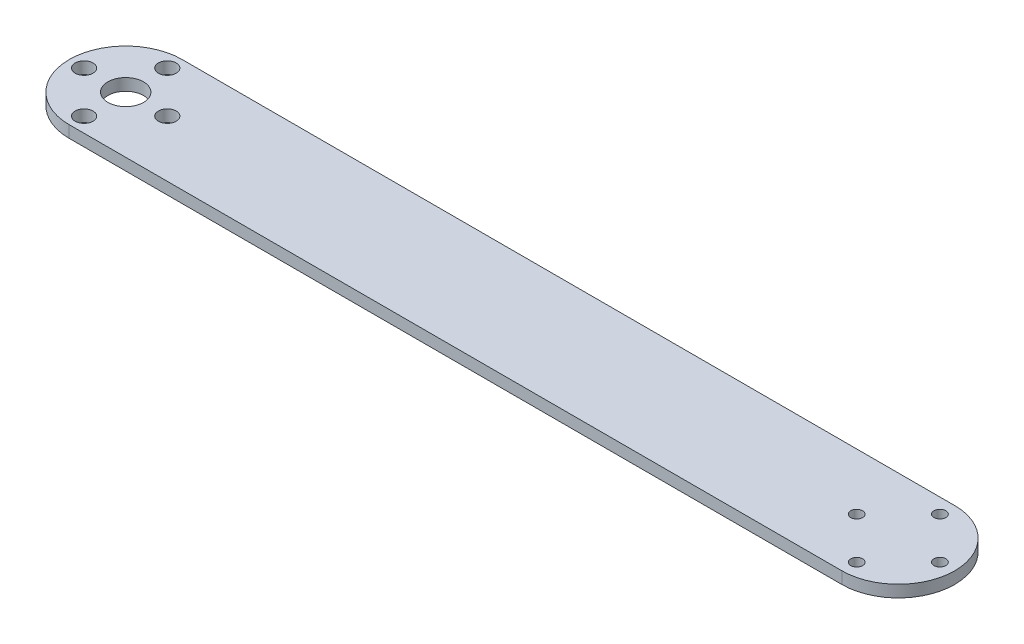
ISO-10303-21;
HEADER;
FILE_DESCRIPTION(('STEP AP214'),'2;1');
FILE_NAME('part.step','',(''),(''),'','','');
FILE_SCHEMA(('AUTOMOTIVE_DESIGN { 1 0 10303 214 1 1 1 1 }'));
ENDSEC;
DATA;
#1=APPLICATION_CONTEXT('core data for automotive mechanical design processes');
#2=APPLICATION_PROTOCOL_DEFINITION('international standard','automotive_design',2000,#1);
#3=PRODUCT_CONTEXT('',#1,'mechanical');
#4=PRODUCT('Part','Part','',(#3));
#5=PRODUCT_RELATED_PRODUCT_CATEGORY('part','',(#4));
#6=PRODUCT_DEFINITION_FORMATION('','',#4);
#7=PRODUCT_DEFINITION_CONTEXT('part definition',#1,'design');
#8=PRODUCT_DEFINITION('design','',#6,#7);
#9=PRODUCT_DEFINITION_SHAPE('','',#8);
#10=(LENGTH_UNIT() NAMED_UNIT(*) SI_UNIT(.MILLI.,.METRE.));
#11=(NAMED_UNIT(*) PLANE_ANGLE_UNIT() SI_UNIT($,.RADIAN.));
#12=(NAMED_UNIT(*) SI_UNIT($,.STERADIAN.) SOLID_ANGLE_UNIT());
#13=UNCERTAINTY_MEASURE_WITH_UNIT(LENGTH_MEASURE(1.E-05),#10,'distance_accuracy_value','');
#14=(GEOMETRIC_REPRESENTATION_CONTEXT(3) GLOBAL_UNCERTAINTY_ASSIGNED_CONTEXT((#13)) GLOBAL_UNIT_ASSIGNED_CONTEXT((#10,
#11,#12)) REPRESENTATION_CONTEXT('',''));
#15=CARTESIAN_POINT('',(0.,0.,0.));
#16=DIRECTION('',(0.,0.,1.));
#17=DIRECTION('',(1.,0.,0.));
#18=AXIS2_PLACEMENT_3D('',#15,#16,#17);
#19=CARTESIAN_POINT('',(0.,2.,0.));
#20=DIRECTION('',(0.,1.,0.));
#21=DIRECTION('',(0.,0.,1.));
#22=AXIS2_PLACEMENT_3D('',#19,#20,#21);
#23=PLANE('',#22);
#24=CARTESIAN_POINT('',(123.,2.,0.));
#25=DIRECTION('',(0.,1.,0.));
#26=DIRECTION('',(0.,0.,1.));
#27=AXIS2_PLACEMENT_3D('',#24,#25,#26);
#28=CIRCLE('',#27,0.999999999999998);
#29=CARTESIAN_POINT('',(123.,2.,0.999999999999998));
#30=VERTEX_POINT('',#29);
#31=EDGE_CURVE('E152',#30,#30,#28,.T.);
#32=ORIENTED_EDGE('',*,*,#31,.F.);
#33=EDGE_LOOP('',(#32));
#34=FACE_BOUND('',#33,.T.);
#35=CARTESIAN_POINT('',(130.,2.,-7.00000000000001));
#36=DIRECTION('',(0.,1.,0.));
#37=DIRECTION('',(0.,0.,1.));
#38=AXIS2_PLACEMENT_3D('',#35,#36,#37);
#39=CIRCLE('',#38,0.999999999999998);
#40=CARTESIAN_POINT('',(130.,2.,-6.00000000000002));
#41=VERTEX_POINT('',#40);
#42=EDGE_CURVE('E140',#41,#41,#39,.T.);
#43=ORIENTED_EDGE('',*,*,#42,.F.);
#44=EDGE_LOOP('',(#43));
#45=FACE_BOUND('',#44,.T.);
#46=CARTESIAN_POINT('',(-7.,2.,0.));
#47=DIRECTION('',(0.,1.,0.));
#48=DIRECTION('',(0.,0.,1.));
#49=AXIS2_PLACEMENT_3D('',#46,#47,#48);
#50=CIRCLE('',#49,1.5);
#51=CARTESIAN_POINT('',(-7.,2.,1.5));
#52=VERTEX_POINT('',#51);
#53=EDGE_CURVE('E128',#52,#52,#50,.T.);
#54=ORIENTED_EDGE('',*,*,#53,.F.);
#55=EDGE_LOOP('',(#54));
#56=FACE_BOUND('',#55,.T.);
#57=CARTESIAN_POINT('',(7.,2.,0.));
#58=DIRECTION('',(0.,1.,0.));
#59=DIRECTION('',(0.,0.,1.));
#60=AXIS2_PLACEMENT_3D('',#57,#58,#59);
#61=CIRCLE('',#60,1.5);
#62=CARTESIAN_POINT('',(7.,2.,1.5));
#63=VERTEX_POINT('',#62);
#64=EDGE_CURVE('E116',#63,#63,#61,.T.);
#65=ORIENTED_EDGE('',*,*,#64,.F.);
#66=EDGE_LOOP('',(#65));
#67=FACE_BOUND('',#66,.T.);
#68=CARTESIAN_POINT('',(0.,2.,0.));
#69=DIRECTION('',(0.,1.,0.));
#70=DIRECTION('',(0.,0.,1.));
#71=AXIS2_PLACEMENT_3D('',#68,#69,#70);
#72=CIRCLE('',#71,9.5);
#73=CARTESIAN_POINT('',(0.,2.,-9.5));
#74=VERTEX_POINT('',#73);
#75=CARTESIAN_POINT('',(0.,2.,9.5));
#76=VERTEX_POINT('',#75);
#77=EDGE_CURVE('E86',#74,#76,#72,.T.);
#78=ORIENTED_EDGE('',*,*,#77,.T.);
#79=DIRECTION('',(1.,0.,0.));
#80=VECTOR('',#79,1.);
#81=CARTESIAN_POINT('',(0.,2.,9.5));
#82=LINE('',#81,#80);
#83=CARTESIAN_POINT('',(130.,2.,9.5));
#84=VERTEX_POINT('',#83);
#85=EDGE_CURVE('E81',#76,#84,#82,.T.);
#86=ORIENTED_EDGE('',*,*,#85,.T.);
#87=CARTESIAN_POINT('',(130.,2.,0.));
#88=DIRECTION('',(0.,1.,0.));
#89=DIRECTION('',(0.,0.,1.));
#90=AXIS2_PLACEMENT_3D('',#87,#88,#89);
#91=CIRCLE('',#90,9.5);
#92=CARTESIAN_POINT('',(130.,2.,-9.5));
#93=VERTEX_POINT('',#92);
#94=EDGE_CURVE('E84',#84,#93,#91,.T.);
#95=ORIENTED_EDGE('',*,*,#94,.T.);
#96=DIRECTION('',(-1.,0.,0.));
#97=VECTOR('',#96,1.);
#98=CARTESIAN_POINT('',(0.,2.,-9.5));
#99=LINE('',#98,#97);
#100=EDGE_CURVE('E51',#93,#74,#99,.T.);
#101=ORIENTED_EDGE('',*,*,#100,.T.);
#102=EDGE_LOOP('',(#78,#86,#95,#101));
#103=FACE_BOUND('',#102,.T.);
#104=CARTESIAN_POINT('',(0.,2.,-7.));
#105=DIRECTION('',(0.,1.,0.));
#106=DIRECTION('',(0.,0.,1.));
#107=AXIS2_PLACEMENT_3D('',#104,#105,#106);
#108=CIRCLE('',#107,1.5);
#109=CARTESIAN_POINT('',(0.,2.,-5.5));
#110=VERTEX_POINT('',#109);
#111=EDGE_CURVE('E101',#110,#110,#108,.T.);
#112=ORIENTED_EDGE('',*,*,#111,.F.);
#113=EDGE_LOOP('',(#112));
#114=FACE_BOUND('',#113,.T.);
#115=CARTESIAN_POINT('',(0.,2.,7.));
#116=DIRECTION('',(0.,1.,0.));
#117=DIRECTION('',(0.,0.,1.));
#118=AXIS2_PLACEMENT_3D('',#115,#116,#117);
#119=CIRCLE('',#118,1.5);
#120=CARTESIAN_POINT('',(0.,2.,8.5));
#121=VERTEX_POINT('',#120);
#122=EDGE_CURVE('E122',#121,#121,#119,.T.);
#123=ORIENTED_EDGE('',*,*,#122,.F.);
#124=EDGE_LOOP('',(#123));
#125=FACE_BOUND('',#124,.T.);
#126=CARTESIAN_POINT('',(0.,2.,0.));
#127=DIRECTION('',(0.,1.,0.));
#128=DIRECTION('',(0.,0.,1.));
#129=AXIS2_PLACEMENT_3D('',#126,#127,#128);
#130=CIRCLE('',#129,3.);
#131=CARTESIAN_POINT('',(0.,2.,3.));
#132=VERTEX_POINT('',#131);
#133=EDGE_CURVE('E134',#132,#132,#130,.T.);
#134=ORIENTED_EDGE('',*,*,#133,.F.);
#135=EDGE_LOOP('',(#134));
#136=FACE_BOUND('',#135,.T.);
#137=CARTESIAN_POINT('',(137.,2.,0.));
#138=DIRECTION('',(0.,1.,0.));
#139=DIRECTION('',(0.,0.,1.));
#140=AXIS2_PLACEMENT_3D('',#137,#138,#139);
#141=CIRCLE('',#140,0.999999999999998);
#142=CARTESIAN_POINT('',(137.,2.,0.999999999999998));
#143=VERTEX_POINT('',#142);
#144=EDGE_CURVE('E146',#143,#143,#141,.T.);
#145=ORIENTED_EDGE('',*,*,#144,.F.);
#146=EDGE_LOOP('',(#145));
#147=FACE_BOUND('',#146,.T.);
#148=CARTESIAN_POINT('',(130.,2.,7.00000000000001));
#149=DIRECTION('',(0.,1.,0.));
#150=DIRECTION('',(0.,0.,1.));
#151=AXIS2_PLACEMENT_3D('',#148,#149,#150);
#152=CIRCLE('',#151,0.999999999999998);
#153=CARTESIAN_POINT('',(130.,2.,8.00000000000001));
#154=VERTEX_POINT('',#153);
#155=EDGE_CURVE('E158',#154,#154,#152,.T.);
#156=ORIENTED_EDGE('',*,*,#155,.F.);
#157=EDGE_LOOP('',(#156));
#158=FACE_BOUND('',#157,.T.);
#159=ADVANCED_FACE('F34',(#34,#45,#56,#67,#103,#114,#125,#136,#147,#158),#23,.T.);
#160=CARTESIAN_POINT('',(0.,0.,0.));
#161=DIRECTION('',(0.,1.,0.));
#162=DIRECTION('',(0.,0.,1.));
#163=AXIS2_PLACEMENT_3D('',#160,#161,#162);
#164=PLANE('',#163);
#165=CARTESIAN_POINT('',(0.,0.,0.));
#166=DIRECTION('',(0.,1.,0.));
#167=DIRECTION('',(0.,0.,1.));
#168=AXIS2_PLACEMENT_3D('',#165,#166,#167);
#169=CIRCLE('',#168,9.5);
#170=CARTESIAN_POINT('',(0.,0.,-9.5));
#171=VERTEX_POINT('',#170);
#172=CARTESIAN_POINT('',(0.,0.,9.5));
#173=VERTEX_POINT('',#172);
#174=EDGE_CURVE('E98',#171,#173,#169,.T.);
#175=ORIENTED_EDGE('',*,*,#174,.F.);
#176=DIRECTION('',(-1.,0.,0.));
#177=VECTOR('',#176,1.);
#178=CARTESIAN_POINT('',(0.,0.,-9.5));
#179=LINE('',#178,#177);
#180=CARTESIAN_POINT('',(130.,0.,-9.5));
#181=VERTEX_POINT('',#180);
#182=EDGE_CURVE('E74',#181,#171,#179,.T.);
#183=ORIENTED_EDGE('',*,*,#182,.F.);
#184=CARTESIAN_POINT('',(130.,0.,0.));
#185=DIRECTION('',(0.,1.,0.));
#186=DIRECTION('',(0.,0.,1.));
#187=AXIS2_PLACEMENT_3D('',#184,#185,#186);
#188=CIRCLE('',#187,9.5);
#189=CARTESIAN_POINT('',(130.,0.,9.5));
#190=VERTEX_POINT('',#189);
#191=EDGE_CURVE('E68',#190,#181,#188,.T.);
#192=ORIENTED_EDGE('',*,*,#191,.F.);
#193=DIRECTION('',(1.,0.,0.));
#194=VECTOR('',#193,1.);
#195=CARTESIAN_POINT('',(0.,0.,9.5));
#196=LINE('',#195,#194);
#197=EDGE_CURVE('E90',#173,#190,#196,.T.);
#198=ORIENTED_EDGE('',*,*,#197,.F.);
#199=EDGE_LOOP('',(#175,#183,#192,#198));
#200=FACE_BOUND('',#199,.T.);
#201=CARTESIAN_POINT('',(0.,0.,-7.));
#202=DIRECTION('',(0.,1.,0.));
#203=DIRECTION('',(0.,0.,1.));
#204=AXIS2_PLACEMENT_3D('',#201,#202,#203);
#205=CIRCLE('',#204,1.5);
#206=CARTESIAN_POINT('',(0.,0.,-5.5));
#207=VERTEX_POINT('',#206);
#208=EDGE_CURVE('E113',#207,#207,#205,.T.);
#209=ORIENTED_EDGE('',*,*,#208,.T.);
#210=EDGE_LOOP('',(#209));
#211=FACE_BOUND('',#210,.T.);
#212=CARTESIAN_POINT('',(7.,0.,0.));
#213=DIRECTION('',(0.,1.,0.));
#214=DIRECTION('',(0.,0.,1.));
#215=AXIS2_PLACEMENT_3D('',#212,#213,#214);
#216=CIRCLE('',#215,1.5);
#217=CARTESIAN_POINT('',(7.,0.,1.5));
#218=VERTEX_POINT('',#217);
#219=EDGE_CURVE('E119',#218,#218,#216,.T.);
#220=ORIENTED_EDGE('',*,*,#219,.T.);
#221=EDGE_LOOP('',(#220));
#222=FACE_BOUND('',#221,.T.);
#223=CARTESIAN_POINT('',(0.,0.,7.));
#224=DIRECTION('',(0.,1.,0.));
#225=DIRECTION('',(0.,0.,1.));
#226=AXIS2_PLACEMENT_3D('',#223,#224,#225);
#227=CIRCLE('',#226,1.5);
#228=CARTESIAN_POINT('',(0.,0.,8.5));
#229=VERTEX_POINT('',#228);
#230=EDGE_CURVE('E125',#229,#229,#227,.T.);
#231=ORIENTED_EDGE('',*,*,#230,.T.);
#232=EDGE_LOOP('',(#231));
#233=FACE_BOUND('',#232,.T.);
#234=CARTESIAN_POINT('',(-7.,0.,0.));
#235=DIRECTION('',(0.,1.,0.));
#236=DIRECTION('',(0.,0.,1.));
#237=AXIS2_PLACEMENT_3D('',#234,#235,#236);
#238=CIRCLE('',#237,1.5);
#239=CARTESIAN_POINT('',(-7.,0.,1.5));
#240=VERTEX_POINT('',#239);
#241=EDGE_CURVE('E131',#240,#240,#238,.T.);
#242=ORIENTED_EDGE('',*,*,#241,.T.);
#243=EDGE_LOOP('',(#242));
#244=FACE_BOUND('',#243,.T.);
#245=CARTESIAN_POINT('',(0.,0.,0.));
#246=DIRECTION('',(0.,1.,0.));
#247=DIRECTION('',(0.,0.,1.));
#248=AXIS2_PLACEMENT_3D('',#245,#246,#247);
#249=CIRCLE('',#248,3.);
#250=CARTESIAN_POINT('',(0.,0.,3.));
#251=VERTEX_POINT('',#250);
#252=EDGE_CURVE('E137',#251,#251,#249,.T.);
#253=ORIENTED_EDGE('',*,*,#252,.T.);
#254=EDGE_LOOP('',(#253));
#255=FACE_BOUND('',#254,.T.);
#256=CARTESIAN_POINT('',(130.,0.,-7.00000000000001));
#257=DIRECTION('',(0.,1.,0.));
#258=DIRECTION('',(0.,0.,1.));
#259=AXIS2_PLACEMENT_3D('',#256,#257,#258);
#260=CIRCLE('',#259,0.999999999999998);
#261=CARTESIAN_POINT('',(130.,0.,-6.00000000000002));
#262=VERTEX_POINT('',#261);
#263=EDGE_CURVE('E143',#262,#262,#260,.T.);
#264=ORIENTED_EDGE('',*,*,#263,.T.);
#265=EDGE_LOOP('',(#264));
#266=FACE_BOUND('',#265,.T.);
#267=CARTESIAN_POINT('',(137.,0.,0.));
#268=DIRECTION('',(0.,1.,0.));
#269=DIRECTION('',(0.,0.,1.));
#270=AXIS2_PLACEMENT_3D('',#267,#268,#269);
#271=CIRCLE('',#270,0.999999999999998);
#272=CARTESIAN_POINT('',(137.,0.,0.999999999999998));
#273=VERTEX_POINT('',#272);
#274=EDGE_CURVE('E149',#273,#273,#271,.T.);
#275=ORIENTED_EDGE('',*,*,#274,.T.);
#276=EDGE_LOOP('',(#275));
#277=FACE_BOUND('',#276,.T.);
#278=CARTESIAN_POINT('',(123.,0.,0.));
#279=DIRECTION('',(0.,1.,0.));
#280=DIRECTION('',(0.,0.,1.));
#281=AXIS2_PLACEMENT_3D('',#278,#279,#280);
#282=CIRCLE('',#281,0.999999999999998);
#283=CARTESIAN_POINT('',(123.,0.,0.999999999999998));
#284=VERTEX_POINT('',#283);
#285=EDGE_CURVE('E155',#284,#284,#282,.T.);
#286=ORIENTED_EDGE('',*,*,#285,.T.);
#287=EDGE_LOOP('',(#286));
#288=FACE_BOUND('',#287,.T.);
#289=CARTESIAN_POINT('',(130.,0.,7.00000000000001));
#290=DIRECTION('',(0.,1.,0.));
#291=DIRECTION('',(0.,0.,1.));
#292=AXIS2_PLACEMENT_3D('',#289,#290,#291);
#293=CIRCLE('',#292,0.999999999999998);
#294=CARTESIAN_POINT('',(130.,0.,8.00000000000001));
#295=VERTEX_POINT('',#294);
#296=EDGE_CURVE('E161',#295,#295,#293,.T.);
#297=ORIENTED_EDGE('',*,*,#296,.T.);
#298=EDGE_LOOP('',(#297));
#299=FACE_BOUND('',#298,.T.);
#300=ADVANCED_FACE('F109',(#200,#211,#222,#233,#244,#255,#266,#277,#288,#299),#164,.F.);
#301=CARTESIAN_POINT('',(0.,2.,0.));
#302=DIRECTION('',(0.,-1.,0.));
#303=DIRECTION('',(0.,0.,-1.));
#304=AXIS2_PLACEMENT_3D('',#301,#302,#303);
#305=CYLINDRICAL_SURFACE('',#304,9.5);
#306=ORIENTED_EDGE('',*,*,#174,.T.);
#307=DIRECTION('',(0.,-1.,0.));
#308=VECTOR('',#307,1.);
#309=CARTESIAN_POINT('',(0.,2.,9.5));
#310=LINE('',#309,#308);
#311=EDGE_CURVE('E11',#76,#173,#310,.T.);
#312=ORIENTED_EDGE('',*,*,#311,.F.);
#313=ORIENTED_EDGE('',*,*,#77,.F.);
#314=DIRECTION('',(0.,-1.,0.));
#315=VECTOR('',#314,1.);
#316=CARTESIAN_POINT('',(0.,2.,-9.5));
#317=LINE('',#316,#315);
#318=EDGE_CURVE('E94',#74,#171,#317,.T.);
#319=ORIENTED_EDGE('',*,*,#318,.T.);
#320=EDGE_LOOP('',(#306,#312,#313,#319));
#321=FACE_BOUND('',#320,.T.);
#322=ADVANCED_FACE('F36',(#321),#305,.T.);
#323=CARTESIAN_POINT('',(0.,2.,9.5));
#324=DIRECTION('',(0.,0.,-1.));
#325=DIRECTION('',(-1.,0.,0.));
#326=AXIS2_PLACEMENT_3D('',#323,#324,#325);
#327=PLANE('',#326);
#328=ORIENTED_EDGE('',*,*,#197,.T.);
#329=DIRECTION('',(0.,-1.,0.));
#330=VECTOR('',#329,1.);
#331=CARTESIAN_POINT('',(130.,2.,9.5));
#332=LINE('',#331,#330);
#333=EDGE_CURVE('E43',#84,#190,#332,.T.);
#334=ORIENTED_EDGE('',*,*,#333,.F.);
#335=ORIENTED_EDGE('',*,*,#85,.F.);
#336=ORIENTED_EDGE('',*,*,#311,.T.);
#337=EDGE_LOOP('',(#328,#334,#335,#336));
#338=FACE_BOUND('',#337,.T.);
#339=ADVANCED_FACE('F89',(#338),#327,.F.);
#340=CARTESIAN_POINT('',(130.,2.,0.));
#341=DIRECTION('',(0.,-1.,0.));
#342=DIRECTION('',(0.,0.,-1.));
#343=AXIS2_PLACEMENT_3D('',#340,#341,#342);
#344=CYLINDRICAL_SURFACE('',#343,9.5);
#345=ORIENTED_EDGE('',*,*,#191,.T.);
#346=DIRECTION('',(0.,-1.,0.));
#347=VECTOR('',#346,1.);
#348=CARTESIAN_POINT('',(130.,2.,-9.5));
#349=LINE('',#348,#347);
#350=EDGE_CURVE('E91',#93,#181,#349,.T.);
#351=ORIENTED_EDGE('',*,*,#350,.F.);
#352=ORIENTED_EDGE('',*,*,#94,.F.);
#353=ORIENTED_EDGE('',*,*,#333,.T.);
#354=EDGE_LOOP('',(#345,#351,#352,#353));
#355=FACE_BOUND('',#354,.T.);
#356=ADVANCED_FACE('F92',(#355),#344,.T.);
#357=CARTESIAN_POINT('',(0.,2.,-9.5));
#358=DIRECTION('',(0.,0.,1.));
#359=DIRECTION('',(1.,0.,0.));
#360=AXIS2_PLACEMENT_3D('',#357,#358,#359);
#361=PLANE('',#360);
#362=ORIENTED_EDGE('',*,*,#182,.T.);
#363=ORIENTED_EDGE('',*,*,#318,.F.);
#364=ORIENTED_EDGE('',*,*,#100,.F.);
#365=ORIENTED_EDGE('',*,*,#350,.T.);
#366=EDGE_LOOP('',(#362,#363,#364,#365));
#367=FACE_BOUND('',#366,.T.);
#368=ADVANCED_FACE('F106',(#367),#361,.F.);
#369=CARTESIAN_POINT('',(0.,2.,-7.));
#370=DIRECTION('',(0.,-1.,0.));
#371=DIRECTION('',(0.,0.,-1.));
#372=AXIS2_PLACEMENT_3D('',#369,#370,#371);
#373=CYLINDRICAL_SURFACE('',#372,1.5);
#374=ORIENTED_EDGE('',*,*,#111,.T.);
#375=EDGE_LOOP('',(#374));
#376=FACE_BOUND('',#375,.T.);
#377=ORIENTED_EDGE('',*,*,#208,.F.);
#378=EDGE_LOOP('',(#377));
#379=FACE_BOUND('',#378,.T.);
#380=ADVANCED_FACE('F180',(#376,#379),#373,.F.);
#381=CARTESIAN_POINT('',(7.,2.,0.));
#382=DIRECTION('',(0.,-1.,0.));
#383=DIRECTION('',(0.,0.,-1.));
#384=AXIS2_PLACEMENT_3D('',#381,#382,#383);
#385=CYLINDRICAL_SURFACE('',#384,1.5);
#386=ORIENTED_EDGE('',*,*,#64,.T.);
#387=EDGE_LOOP('',(#386));
#388=FACE_BOUND('',#387,.T.);
#389=ORIENTED_EDGE('',*,*,#219,.F.);
#390=EDGE_LOOP('',(#389));
#391=FACE_BOUND('',#390,.T.);
#392=ADVANCED_FACE('F226',(#388,#391),#385,.F.);
#393=CARTESIAN_POINT('',(0.,2.,7.));
#394=DIRECTION('',(0.,-1.,0.));
#395=DIRECTION('',(0.,0.,-1.));
#396=AXIS2_PLACEMENT_3D('',#393,#394,#395);
#397=CYLINDRICAL_SURFACE('',#396,1.5);
#398=ORIENTED_EDGE('',*,*,#122,.T.);
#399=EDGE_LOOP('',(#398));
#400=FACE_BOUND('',#399,.T.);
#401=ORIENTED_EDGE('',*,*,#230,.F.);
#402=EDGE_LOOP('',(#401));
#403=FACE_BOUND('',#402,.T.);
#404=ADVANCED_FACE('F234',(#400,#403),#397,.F.);
#405=CARTESIAN_POINT('',(-7.,2.,0.));
#406=DIRECTION('',(0.,-1.,0.));
#407=DIRECTION('',(0.,0.,-1.));
#408=AXIS2_PLACEMENT_3D('',#405,#406,#407);
#409=CYLINDRICAL_SURFACE('',#408,1.5);
#410=ORIENTED_EDGE('',*,*,#53,.T.);
#411=EDGE_LOOP('',(#410));
#412=FACE_BOUND('',#411,.T.);
#413=ORIENTED_EDGE('',*,*,#241,.F.);
#414=EDGE_LOOP('',(#413));
#415=FACE_BOUND('',#414,.T.);
#416=ADVANCED_FACE('F242',(#412,#415),#409,.F.);
#417=CARTESIAN_POINT('',(0.,2.,0.));
#418=DIRECTION('',(0.,-1.,0.));
#419=DIRECTION('',(0.,0.,-1.));
#420=AXIS2_PLACEMENT_3D('',#417,#418,#419);
#421=CYLINDRICAL_SURFACE('',#420,3.);
#422=ORIENTED_EDGE('',*,*,#133,.T.);
#423=EDGE_LOOP('',(#422));
#424=FACE_BOUND('',#423,.T.);
#425=ORIENTED_EDGE('',*,*,#252,.F.);
#426=EDGE_LOOP('',(#425));
#427=FACE_BOUND('',#426,.T.);
#428=ADVANCED_FACE('F251',(#424,#427),#421,.F.);
#429=CARTESIAN_POINT('',(130.,2.,-7.00000000000001));
#430=DIRECTION('',(0.,-1.,0.));
#431=DIRECTION('',(0.,0.,-1.));
#432=AXIS2_PLACEMENT_3D('',#429,#430,#431);
#433=CYLINDRICAL_SURFACE('',#432,0.999999999999998);
#434=ORIENTED_EDGE('',*,*,#42,.T.);
#435=EDGE_LOOP('',(#434));
#436=FACE_BOUND('',#435,.T.);
#437=ORIENTED_EDGE('',*,*,#263,.F.);
#438=EDGE_LOOP('',(#437));
#439=FACE_BOUND('',#438,.T.);
#440=ADVANCED_FACE('F260',(#436,#439),#433,.F.);
#441=CARTESIAN_POINT('',(137.,2.,0.));
#442=DIRECTION('',(0.,-1.,0.));
#443=DIRECTION('',(0.,0.,-1.));
#444=AXIS2_PLACEMENT_3D('',#441,#442,#443);
#445=CYLINDRICAL_SURFACE('',#444,0.999999999999998);
#446=ORIENTED_EDGE('',*,*,#144,.T.);
#447=EDGE_LOOP('',(#446));
#448=FACE_BOUND('',#447,.T.);
#449=ORIENTED_EDGE('',*,*,#274,.F.);
#450=EDGE_LOOP('',(#449));
#451=FACE_BOUND('',#450,.T.);
#452=ADVANCED_FACE('F269',(#448,#451),#445,.F.);
#453=CARTESIAN_POINT('',(123.,2.,0.));
#454=DIRECTION('',(0.,-1.,0.));
#455=DIRECTION('',(0.,0.,-1.));
#456=AXIS2_PLACEMENT_3D('',#453,#454,#455);
#457=CYLINDRICAL_SURFACE('',#456,0.999999999999998);
#458=ORIENTED_EDGE('',*,*,#31,.T.);
#459=EDGE_LOOP('',(#458));
#460=FACE_BOUND('',#459,.T.);
#461=ORIENTED_EDGE('',*,*,#285,.F.);
#462=EDGE_LOOP('',(#461));
#463=FACE_BOUND('',#462,.T.);
#464=ADVANCED_FACE('F278',(#460,#463),#457,.F.);
#465=CARTESIAN_POINT('',(130.,2.,7.00000000000001));
#466=DIRECTION('',(0.,-1.,0.));
#467=DIRECTION('',(0.,0.,-1.));
#468=AXIS2_PLACEMENT_3D('',#465,#466,#467);
#469=CYLINDRICAL_SURFACE('',#468,0.999999999999998);
#470=ORIENTED_EDGE('',*,*,#155,.T.);
#471=EDGE_LOOP('',(#470));
#472=FACE_BOUND('',#471,.T.);
#473=ORIENTED_EDGE('',*,*,#296,.F.);
#474=EDGE_LOOP('',(#473));
#475=FACE_BOUND('',#474,.T.);
#476=ADVANCED_FACE('F167',(#472,#475),#469,.F.);
#477=CLOSED_SHELL('',(#159,#300,#322,#339,#356,#368,#380,#392,#404,#416,#428,#440,#452,#464,#476));
#478=MANIFOLD_SOLID_BREP('B2',#477);
#479=ADVANCED_BREP_SHAPE_REPRESENTATION('',(#18,#478),#14);
#480=SHAPE_DEFINITION_REPRESENTATION(#9,#479);
ENDSEC;
END-ISO-10303-21;
